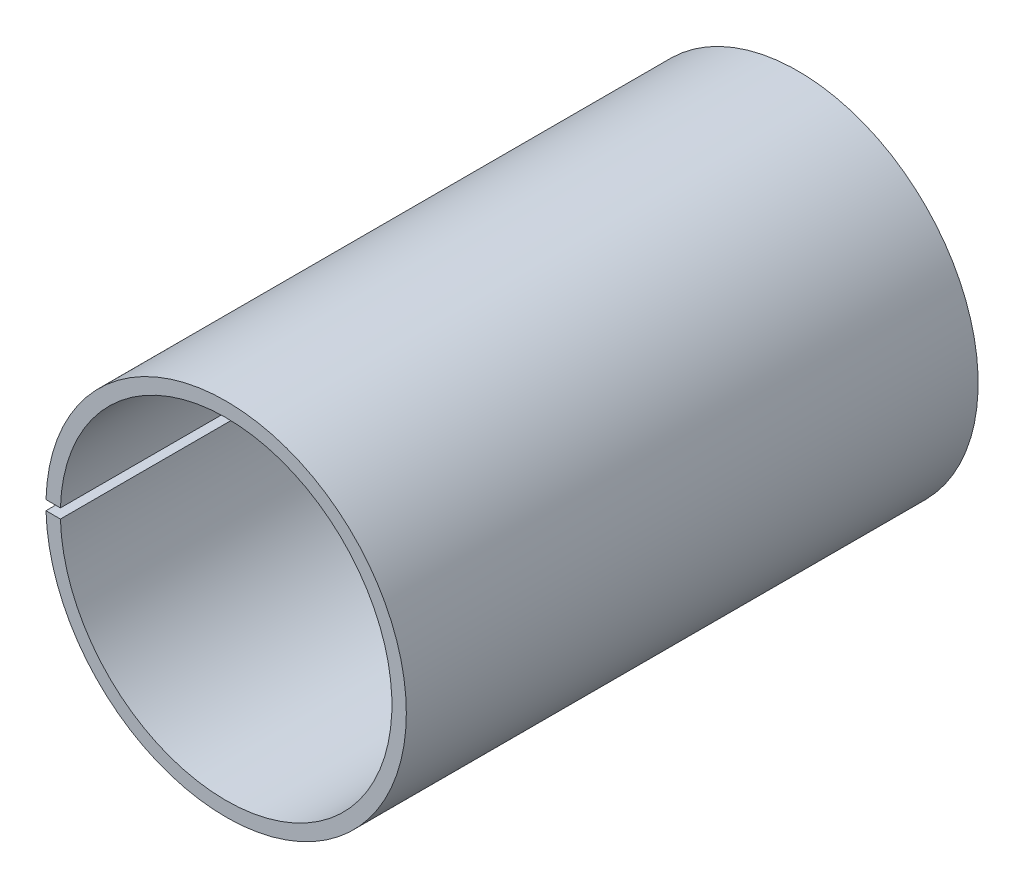
ISO-10303-21;
HEADER;
FILE_DESCRIPTION(('STEP AP214'),'2;1');
FILE_NAME('part.step','',(''),(''),'','','');
FILE_SCHEMA(('AUTOMOTIVE_DESIGN { 1 0 10303 214 1 1 1 1 }'));
ENDSEC;
DATA;
#1=APPLICATION_CONTEXT('core data for automotive mechanical design processes');
#2=APPLICATION_PROTOCOL_DEFINITION('international standard','automotive_design',2000,#1);
#3=PRODUCT_CONTEXT('',#1,'mechanical');
#4=PRODUCT('Part','Part','',(#3));
#5=PRODUCT_RELATED_PRODUCT_CATEGORY('part','',(#4));
#6=PRODUCT_DEFINITION_FORMATION('','',#4);
#7=PRODUCT_DEFINITION_CONTEXT('part definition',#1,'design');
#8=PRODUCT_DEFINITION('design','',#6,#7);
#9=PRODUCT_DEFINITION_SHAPE('','',#8);
#10=(LENGTH_UNIT() NAMED_UNIT(*) SI_UNIT(.MILLI.,.METRE.));
#11=(NAMED_UNIT(*) PLANE_ANGLE_UNIT() SI_UNIT($,.RADIAN.));
#12=(NAMED_UNIT(*) SI_UNIT($,.STERADIAN.) SOLID_ANGLE_UNIT());
#13=UNCERTAINTY_MEASURE_WITH_UNIT(LENGTH_MEASURE(1.E-05),#10,'distance_accuracy_value','');
#14=(GEOMETRIC_REPRESENTATION_CONTEXT(3) GLOBAL_UNCERTAINTY_ASSIGNED_CONTEXT((#13)) GLOBAL_UNIT_ASSIGNED_CONTEXT((#10,
#11,#12)) REPRESENTATION_CONTEXT('',''));
#15=CARTESIAN_POINT('',(0.,0.,0.));
#16=DIRECTION('',(0.,0.,1.));
#17=DIRECTION('',(1.,0.,0.));
#18=AXIS2_PLACEMENT_3D('',#15,#16,#17);
#19=CARTESIAN_POINT('',(-37.501,0.,-44.5));
#20=DIRECTION('',(1.,0.,0.));
#21=DIRECTION('',(0.,0.,-1.));
#22=AXIS2_PLACEMENT_3D('',#19,#20,#21);
#23=CYLINDRICAL_SURFACE('',#22,5.);
#24=CARTESIAN_POINT('',(-34.1357583773966,-5.,-44.5));
#25=CARTESIAN_POINT('',(-34.1357495207327,-5.00001593466062,-44.3601594966186));
#26=CARTESIAN_POINT('',(-34.1366173819966,-4.99413407462606,-44.2203222756865));
#27=CARTESIAN_POINT('',(-34.1400423843779,-4.97069061917161,-43.9416629096984));
#28=CARTESIAN_POINT('',(-34.1425993782241,-4.95313004198874,-43.8028406772149));
#29=CARTESIAN_POINT('',(-34.1493346927545,-4.90647141655123,-43.527351226803));
#30=CARTESIAN_POINT('',(-34.1535111731537,-4.8773864630738,-43.3906817454032));
#31=CARTESIAN_POINT('',(-34.1633621443041,-4.80790238828122,-43.1203064294253));
#32=CARTESIAN_POINT('',(-34.169036629403,-4.7675033096568,-42.9866005836668));
#33=CARTESIAN_POINT('',(-34.1817219351774,-4.67568490437873,-42.7230808368293));
#34=CARTESIAN_POINT('',(-34.1887328735937,-4.62426460671311,-42.5932672798256));
#35=CARTESIAN_POINT('',(-34.2038933438526,-4.51076024722466,-42.338401253765));
#36=CARTESIAN_POINT('',(-34.2120432960917,-4.44867224612949,-42.2133505644108));
#37=CARTESIAN_POINT('',(-34.2292452866395,-4.31431908892915,-41.9689754257693));
#38=CARTESIAN_POINT('',(-34.2382969475268,-4.24205818562902,-41.8496486114097));
#39=CARTESIAN_POINT('',(-34.2570540982671,-4.08782087195359,-41.6174394166818));
#40=CARTESIAN_POINT('',(-34.2667598301138,-4.00584085708042,-41.5045594503783));
#41=CARTESIAN_POINT('',(-34.2866122981189,-3.83221822073072,-41.2853817220055));
#42=CARTESIAN_POINT('',(-34.2967614016711,-3.74051867366778,-41.1791292645562));
#43=CARTESIAN_POINT('',(-34.3171615461575,-3.54848521642771,-40.9746730832459));
#44=CARTESIAN_POINT('',(-34.3274126234226,-3.44814812379263,-40.8764723522442));
#45=CARTESIAN_POINT('',(-34.3477227441915,-3.23958559115208,-40.6888643898108));
#46=CARTESIAN_POINT('',(-34.3577818284133,-3.13136184774518,-40.5994552767672));
#47=CARTESIAN_POINT('',(-34.3774316717444,-2.90771300593185,-40.4300005188279));
#48=CARTESIAN_POINT('',(-34.3870222567492,-2.7922852661171,-40.3499583396957));
#49=CARTESIAN_POINT('',(-34.4054996606062,-2.55457628652898,-40.199534464607));
#50=CARTESIAN_POINT('',(-34.4143834326083,-2.43226888630267,-40.1291937246617));
#51=CARTESIAN_POINT('',(-34.4311544502453,-2.18204727342353,-39.9990484798905));
#52=CARTESIAN_POINT('',(-34.43904132426,-2.05413099370397,-39.9392479009339));
#53=CARTESIAN_POINT('',(-34.4535867391194,-1.79369937593557,-39.8306815981175));
#54=CARTESIAN_POINT('',(-34.4602458511917,-1.66118621090048,-39.7819107401735));
#55=CARTESIAN_POINT('',(-34.4721527077645,-1.39240657728121,-39.69571712416));
#56=CARTESIAN_POINT('',(-34.4773999367066,-1.25613875762902,-39.6582985108035));
#57=CARTESIAN_POINT('',(-34.486295564223,-0.981874708549449,-39.5953536072419));
#58=CARTESIAN_POINT('',(-34.4899554386855,-0.843898563969835,-39.5697418706262));
#59=CARTESIAN_POINT('',(-34.4956334108415,-0.566254315458999,-39.530183943241));
#60=CARTESIAN_POINT('',(-34.497650937859,-0.426585640508265,-39.5162418073293));
#61=CARTESIAN_POINT('',(-34.501127471799,-0.00654619748531094,-39.4921737590813));
#62=CARTESIAN_POINT('',(-34.5000205556284,0.275163150869883,-39.4997363399398));
#63=CARTESIAN_POINT('',(-34.4933365305696,0.692213185270354,-39.5461771564353));
#64=CARTESIAN_POINT('',(-34.4902892498962,0.82987133585047,-39.5673814227808));
#65=CARTESIAN_POINT('',(-34.4826357235887,1.10290404187482,-39.6211773286965));
#66=CARTESIAN_POINT('',(-34.4780300196948,1.23827937372934,-39.6537650112827));
#67=CARTESIAN_POINT('',(-34.4673824321818,1.50582373482647,-39.7301080062177));
#68=CARTESIAN_POINT('',(-34.4613400289372,1.63799158488197,-39.7738673595595));
#69=CARTESIAN_POINT('',(-34.4479910412419,1.89812089450507,-39.8722078738541));
#70=CARTESIAN_POINT('',(-34.4406849075513,2.02608383462173,-39.9267851771607));
#71=CARTESIAN_POINT('',(-34.4249779863683,2.27745824812908,-40.0466138096051));
#72=CARTESIAN_POINT('',(-34.4165730129224,2.40084987498875,-40.1119062131812));
#73=CARTESIAN_POINT('',(-34.3989276312613,2.64165655449335,-40.2525203309755));
#74=CARTESIAN_POINT('',(-34.3896875233242,2.75907373174297,-40.3278384449541));
#75=CARTESIAN_POINT('',(-34.3706216973105,2.98721863238484,-40.488022988966));
#76=CARTESIAN_POINT('',(-34.3607957613783,3.09794383597494,-40.5728929816668));
#77=CARTESIAN_POINT('',(-34.3408372049493,3.31186331871825,-40.7515371865901));
#78=CARTESIAN_POINT('',(-34.3307046956701,3.41506028367509,-40.8453081955041));
#79=CARTESIAN_POINT('',(-34.3103143814529,3.61420006053363,-41.0420621406065));
#80=CARTESIAN_POINT('',(-34.3000562965955,3.71006520710218,-41.1451236729286));
#81=CARTESIAN_POINT('',(-34.2798040986215,3.89274665252293,-41.358935145868));
#82=CARTESIAN_POINT('',(-34.2698098907053,3.97956623500926,-41.46968227204));
#83=CARTESIAN_POINT('',(-34.2503587979484,4.14364020611898,-41.6982068645299));
#84=CARTESIAN_POINT('',(-34.2409022763248,4.22088816951672,-41.8159889755182));
#85=CARTESIAN_POINT('',(-34.2228076201595,4.36517188213724,-42.0576504448589));
#86=CARTESIAN_POINT('',(-34.2141691788892,4.43221146463752,-42.1815274913106));
#87=CARTESIAN_POINT('',(-34.1979416895623,4.55572970905516,-42.434762491711));
#88=CARTESIAN_POINT('',(-34.190354411104,4.61219061708731,-42.5641292204842));
#89=CARTESIAN_POINT('',(-34.1764695881894,4.71397559689892,-42.827183517821));
#90=CARTESIAN_POINT('',(-34.1701715493273,4.75930393920247,-42.960869407188));
#91=CARTESIAN_POINT('',(-34.1590518246573,4.83846835994948,-43.231504030664));
#92=CARTESIAN_POINT('',(-34.154228571663,4.87231664192657,-43.3684491333303));
#93=CARTESIAN_POINT('',(-34.146192913372,4.92831726452346,-43.6447003336019));
#94=CARTESIAN_POINT('',(-34.1429797310658,4.95047524707727,-43.7840052587514));
#95=CARTESIAN_POINT('',(-34.1390039684665,4.97780404190264,-44.019642557034));
#96=CARTESIAN_POINT('',(-34.1377875671994,4.98613222684085,-44.1156128688178));
#97=CARTESIAN_POINT('',(-34.1361646134129,4.99722661968588,-44.3077189835021));
#98=CARTESIAN_POINT('',(-34.1357567002741,5.00000217229248,-44.4038542353856));
#99=CARTESIAN_POINT('',(-34.1357583773966,5.,-44.5));
#100=B_SPLINE_CURVE_WITH_KNOTS('',3,(#24,#25,#26,#27,#28,#29,#30,#31,#32,#33,#34,#35,#36,#37,
#38,#39,#40,#41,#42,#43,#44,#45,#46,#47,#48,#49,#50,#51,#52,#53,#54,#55,#56,#57,#58,#59,#60,#61,
#62,#63,#64,#65,#66,#67,#68,#69,#70,#71,#72,#73,#74,#75,#76,#77,#78,#79,#80,#81,#82,#83,#84,#85,
#86,#87,#88,#89,#90,#91,#92,#93,#94,#95,#96,#97,#98,#99),.UNSPECIFIED.,.F.,.F.,(4,2,2,2,2,2,2,2,
2,2,2,2,2,2,2,2,2,2,2,2,2,2,2,2,2,2,2,2,2,2,2,2,2,2,2,2,2,4),(0.,0.419390335518171,
0.838744110275161,1.25762274705706,1.67649980333741,2.09541377948577,2.5144827821535,
2.93337710945545,3.35242727971082,3.77408374075882,4.19589622932859,4.61761824276198,
5.03949580317238,5.46310316466812,5.88686797431181,6.31043512321333,6.73415673121515,
7.15476177070528,7.57551289800937,8.41608693775482,8.83366233498114,9.25109272322552,
9.66867431796741,10.0861072714853,10.5051794513517,10.9241015460512,11.3431804117277,
11.7621090265022,12.1849918664823,12.6077206567612,13.0307316960457,13.4535834996303,
13.8771387281586,14.3005312234929,14.7234722230552,15.1462089170654,15.4350710718346,
15.7234466810521),.UNSPECIFIED.);
#101=CARTESIAN_POINT('',(-34.4855042010408,1.,-39.6010205144336));
#102=VERTEX_POINT('',#101);
#103=CARTESIAN_POINT('',(-34.1357583773966,5.,-44.5));
#104=VERTEX_POINT('',#103);
#105=EDGE_CURVE('E113',#102,#104,#100,.T.);
#106=ORIENTED_EDGE('',*,*,#105,.F.);
#107=DIRECTION('',(1.,0.,0.));
#108=VECTOR('',#107,1.);
#109=CARTESIAN_POINT('',(-37.501,1.,-39.6010205144336));
#110=LINE('',#109,#108);
#111=CARTESIAN_POINT('',(-37.4866642954531,1.,-39.6010205144336));
#112=VERTEX_POINT('',#111);
#113=EDGE_CURVE('E165',#112,#102,#110,.T.);
#114=ORIENTED_EDGE('',*,*,#113,.F.);
#115=CARTESIAN_POINT('',(-37.1651718682963,-5.,-44.5));
#116=CARTESIAN_POINT('',(-37.1651637470477,-5.00001580979405,-44.3600384370275));
#117=CARTESIAN_POINT('',(-37.1659622210388,-4.99412390516598,-44.2200799841313));
#118=CARTESIAN_POINT('',(-37.1691135527353,-4.97063950088845,-43.9411767485982));
#119=CARTESIAN_POINT('',(-37.1714662844249,-4.95304794981952,-43.802231884705));
#120=CARTESIAN_POINT('',(-37.1776640338752,-4.90630400576495,-43.526487464546));
#121=CARTESIAN_POINT('',(-37.1815074565271,-4.87716396947272,-43.3896857772254));
#122=CARTESIAN_POINT('',(-37.1905734124358,-4.80754496925862,-43.1190469203581));
#123=CARTESIAN_POINT('',(-37.1957959386859,-4.76706606294577,-42.9852097357534));
#124=CARTESIAN_POINT('',(-37.2074717716171,-4.67506049985762,-42.7214263346895));
#125=CARTESIAN_POINT('',(-37.2139252244315,-4.62353253126795,-42.5914805823352));
#126=CARTESIAN_POINT('',(-37.2278809384076,-4.50978533332337,-42.336357241749));
#127=CARTESIAN_POINT('',(-37.2353835867118,-4.44756215559284,-42.2111814353737));
#128=CARTESIAN_POINT('',(-37.2512197230548,-4.3129131384033,-41.966570890887));
#129=CARTESIAN_POINT('',(-37.2595528444626,-4.24049179537262,-41.8471336535687));
#130=CARTESIAN_POINT('',(-37.2768212023298,-4.08590862480682,-41.6147208043162));
#131=CARTESIAN_POINT('',(-37.2857566613806,-4.00374318777107,-41.5017476099722));
#132=CARTESIAN_POINT('',(-37.3040239567505,-3.82981459375156,-41.282516471358));
#133=CARTESIAN_POINT('',(-37.3133576150067,-3.7380036815021,-41.1762965633505));
#134=CARTESIAN_POINT('',(-37.3321176598915,-3.54574679369693,-40.9719168800055));
#135=CARTESIAN_POINT('',(-37.3415440795454,-3.44529763637793,-40.8737601008494));
#136=CARTESIAN_POINT('',(-37.3602188986821,-3.23651409003919,-40.6862538740475));
#137=CARTESIAN_POINT('',(-37.369467335996,-3.12818140064043,-40.5969025377464));
#138=CARTESIAN_POINT('',(-37.3875317014284,-2.90432180442261,-40.4275783516507));
#139=CARTESIAN_POINT('',(-37.396347468737,-2.78879225842019,-40.3476089737118));
#140=CARTESIAN_POINT('',(-37.4133236343656,-2.55097455187516,-40.1973989721137));
#141=CARTESIAN_POINT('',(-37.421481706843,-2.42866478366178,-40.1271922885945));
#142=CARTESIAN_POINT('',(-37.4368805182979,-2.1784606727303,-39.9973136388445));
#143=CARTESIAN_POINT('',(-37.4441209155602,-2.0505642734129,-39.9376455936577));
#144=CARTESIAN_POINT('',(-37.457471674016,-1.79019445075284,-39.8293390576829));
#145=CARTESIAN_POINT('',(-37.4635825548032,-1.65772316537527,-39.7806954931364));
#146=CARTESIAN_POINT('',(-37.4745064244377,-1.3890489209886,-39.6947478316197));
#147=CARTESIAN_POINT('',(-37.4793189384886,-1.25284461686411,-39.6574478822357));
#148=CARTESIAN_POINT('',(-37.487478692174,-0.978579612179495,-39.5946935377548));
#149=CARTESIAN_POINT('',(-37.4908349596386,-0.840535981364348,-39.5691660964425));
#150=CARTESIAN_POINT('',(-37.496035462256,-0.562768828489788,-39.5297867041538));
#151=CARTESIAN_POINT('',(-37.4978791717321,-0.423044739504882,-39.5159388122594));
#152=CARTESIAN_POINT('',(-37.5010384944133,-0.00285282080231904,-39.492165047985));
#153=CARTESIAN_POINT('',(-37.4999915116017,0.278937313274021,-39.4999400109844));
#154=CARTESIAN_POINT('',(-37.493795621099,0.696252599761525,-39.546737463294));
#155=CARTESIAN_POINT('',(-37.4909730777515,0.834101476167466,-39.5680889523454));
#156=CARTESIAN_POINT('',(-37.483890481236,1.10750465536123,-39.6222135159313));
#157=CARTESIAN_POINT('',(-37.4796309276124,1.24305973836157,-39.6549826215167));
#158=CARTESIAN_POINT('',(-37.469788222477,1.51094990104977,-39.7317228901254));
#159=CARTESIAN_POINT('',(-37.4642045931692,1.64328379931327,-39.7756980973271));
#160=CARTESIAN_POINT('',(-37.4518731988771,1.90372737385237,-39.8745044854375));
#161=CARTESIAN_POINT('',(-37.4451258510427,2.03183854428584,-39.9293317773119));
#162=CARTESIAN_POINT('',(-37.430627981438,2.28342369944281,-40.0496642871438));
#163=CARTESIAN_POINT('',(-37.4228741082609,2.40688032959573,-40.115205376638));
#164=CARTESIAN_POINT('',(-37.4066004280571,2.647794795432,-40.2563382502258));
#165=CARTESIAN_POINT('',(-37.3980808976018,2.76525477338147,-40.3319264097962));
#166=CARTESIAN_POINT('',(-37.3805071827414,2.99345730173431,-40.4926693042601));
#167=CARTESIAN_POINT('',(-37.3714528037639,3.10419737743412,-40.5778275309406));
#168=CARTESIAN_POINT('',(-37.3530673386214,3.31811447194109,-40.7570625212665));
#169=CARTESIAN_POINT('',(-37.3437363532957,3.42129420044958,-40.8511360615788));
#170=CARTESIAN_POINT('',(-37.3249789055035,3.62022284353852,-41.0483682537192));
#171=CARTESIAN_POINT('',(-37.3155522779226,3.71590545282845,-41.1515937786543));
#172=CARTESIAN_POINT('',(-37.296948587285,3.89820740683747,-41.365715008369));
#173=CARTESIAN_POINT('',(-37.2877714343797,3.98483004739223,-41.4766078993574));
#174=CARTESIAN_POINT('',(-37.2699176756359,4.14849612221482,-41.7054022908017));
#175=CARTESIAN_POINT('',(-37.2612414093625,4.22553309803553,-41.8233084383033));
#176=CARTESIAN_POINT('',(-37.2446471173221,4.36938254144842,-42.0651922559112));
#177=CARTESIAN_POINT('',(-37.2367288081427,4.43619883635233,-42.1891676302201));
#178=CARTESIAN_POINT('',(-37.2218630051217,4.55925030205557,-42.442549544379));
#179=CARTESIAN_POINT('',(-37.2149169816648,4.61546949044965,-42.5719639334402));
#180=CARTESIAN_POINT('',(-37.2022135621998,4.71676934161267,-42.835082075074));
#181=CARTESIAN_POINT('',(-37.1964557120103,4.7618542617778,-42.9687841659999));
#182=CARTESIAN_POINT('',(-37.1862985196108,4.84053465539676,-43.2394194406102));
#183=CARTESIAN_POINT('',(-37.1818977291446,4.87414238147519,-43.3763490106975));
#184=CARTESIAN_POINT('',(-37.1745766115416,4.92966930706451,-43.6525405447053));
#185=CARTESIAN_POINT('',(-37.1716555684515,4.95159415942299,-43.7918013469361));
#186=CARTESIAN_POINT('',(-37.1680731513888,4.97839891887776,-44.0261092693297));
#187=CARTESIAN_POINT('',(-37.1669857406247,4.9865040100507,-44.1207932600004));
#188=CARTESIAN_POINT('',(-37.1655349885731,4.99730098833021,-44.310315039802));
#189=CARTESIAN_POINT('',(-37.1651704324232,5.00000195791881,-44.4051523023359));
#190=CARTESIAN_POINT('',(-37.1651718682963,5.,-44.5));
#191=B_SPLINE_CURVE_WITH_KNOTS('',3,(#115,#116,#117,#118,#119,#120,#121,#122,#123,#124,#125,
#126,#127,#128,#129,#130,#131,#132,#133,#134,#135,#136,#137,#138,#139,#140,#141,#142,#143,#144,
#145,#146,#147,#148,#149,#150,#151,#152,#153,#154,#155,#156,#157,#158,#159,#160,#161,#162,#163,
#164,#165,#166,#167,#168,#169,#170,#171,#172,#173,#174,#175,#176,#177,#178,#179,#180,#181,#182,
#183,#184,#185,#186,#187,#188,#189,#190),.UNSPECIFIED.,.F.,.F.,(4,2,2,2,2,2,2,2,2,2,2,2,2,2,2,2,
2,2,2,2,2,2,2,2,2,2,2,2,2,2,2,2,2,2,2,2,2,4),(0.,0.419753889608401,0.839473750681574,
1.25874572552589,1.67801557022742,2.09733522087851,2.516810006548,2.93610041916768,
3.35554663737769,3.77717728039385,4.1989638951902,4.62065984432959,5.04251135587492,
5.46579461345412,5.88923502908525,6.31248016866782,6.73587987458322,7.15661589696441,
7.57749808073246,8.41834205725349,8.8365351167954,9.25458295042969,9.67278186785235,
10.090831186845,10.5103100036967,10.9296379004406,11.349119295269,11.7684496009644,
12.1911463322652,12.6136887561624,13.0365143485958,13.4591812169691,13.8824805324932,
14.3056177401123,14.7283017996697,15.1507811541809,15.4357437863123,15.7202270899683),.UNSPECIFIED.);
#192=CARTESIAN_POINT('',(-37.1651718682963,5.,-44.5));
#193=VERTEX_POINT('',#192);
#194=EDGE_CURVE('E120',#112,#193,#191,.T.);
#195=ORIENTED_EDGE('',*,*,#194,.T.);
#196=DIRECTION('',(1.,0.,0.));
#197=VECTOR('',#196,1.);
#198=CARTESIAN_POINT('',(-37.501,5.,-44.5));
#199=LINE('',#198,#197);
#200=EDGE_CURVE('E167',#193,#104,#199,.T.);
#201=ORIENTED_EDGE('',*,*,#200,.T.);
#202=EDGE_LOOP('',(#106,#114,#195,#201));
#203=FACE_BOUND('',#202,.T.);
#204=ADVANCED_FACE('F35',(#203),#23,.F.);
#205=CARTESIAN_POINT('',(0.,0.,59.5));
#206=DIRECTION('',(0.,0.,1.));
#207=DIRECTION('',(1.,0.,0.));
#208=AXIS2_PLACEMENT_3D('',#205,#206,#207);
#209=PLANE('',#208);
#210=DIRECTION('',(1.,0.,0.));
#211=VECTOR('',#210,1.);
#212=CARTESIAN_POINT('',(-37.501,1.,59.5));
#213=LINE('',#212,#211);
#214=CARTESIAN_POINT('',(-37.4866642954531,1.,59.5));
#215=VERTEX_POINT('',#214);
#216=CARTESIAN_POINT('',(-34.4855042010408,1.,59.5));
#217=VERTEX_POINT('',#216);
#218=EDGE_CURVE('E105',#215,#217,#213,.T.);
#219=ORIENTED_EDGE('',*,*,#218,.T.);
#220=CARTESIAN_POINT('',(0.,0.,59.5));
#221=DIRECTION('',(0.,0.,1.));
#222=DIRECTION('',(1.,0.,0.));
#223=AXIS2_PLACEMENT_3D('',#220,#221,#222);
#224=CIRCLE('',#223,34.5);
#225=CARTESIAN_POINT('',(-34.4855042010408,-1.,59.5));
#226=VERTEX_POINT('',#225);
#227=EDGE_CURVE('E187',#226,#217,#224,.T.);
#228=ORIENTED_EDGE('',*,*,#227,.F.);
#229=DIRECTION('',(1.,0.,0.));
#230=VECTOR('',#229,1.);
#231=CARTESIAN_POINT('',(-37.501,-1.,59.5));
#232=LINE('',#231,#230);
#233=CARTESIAN_POINT('',(-37.4866642954531,-1.,59.5));
#234=VERTEX_POINT('',#233);
#235=EDGE_CURVE('E177',#234,#226,#232,.T.);
#236=ORIENTED_EDGE('',*,*,#235,.F.);
#237=CARTESIAN_POINT('',(0.,0.,59.5));
#238=DIRECTION('',(0.,0.,1.));
#239=DIRECTION('',(1.,0.,0.));
#240=AXIS2_PLACEMENT_3D('',#237,#238,#239);
#241=CIRCLE('',#240,37.5);
#242=EDGE_CURVE('E11',#234,#215,#241,.T.);
#243=ORIENTED_EDGE('',*,*,#242,.T.);
#244=EDGE_LOOP('',(#219,#228,#236,#243));
#245=FACE_BOUND('',#244,.T.);
#246=ADVANCED_FACE('F154',(#245),#209,.T.);
#247=CARTESIAN_POINT('',(0.,0.,-59.5));
#248=DIRECTION('',(0.,0.,1.));
#249=DIRECTION('',(1.,0.,0.));
#250=AXIS2_PLACEMENT_3D('',#247,#248,#249);
#251=PLANE('',#250);
#252=CARTESIAN_POINT('',(0.,0.,-59.5));
#253=DIRECTION('',(0.,0.,1.));
#254=DIRECTION('',(1.,0.,0.));
#255=AXIS2_PLACEMENT_3D('',#252,#253,#254);
#256=CIRCLE('',#255,37.5);
#257=CARTESIAN_POINT('',(-37.1651718682963,-5.,-59.5));
#258=VERTEX_POINT('',#257);
#259=CARTESIAN_POINT('',(-37.1651718682963,5.,-59.5));
#260=VERTEX_POINT('',#259);
#261=EDGE_CURVE('E39',#258,#260,#256,.T.);
#262=ORIENTED_EDGE('',*,*,#261,.F.);
#263=DIRECTION('',(1.,0.,0.));
#264=VECTOR('',#263,1.);
#265=CARTESIAN_POINT('',(-37.501,-5.,-59.5));
#266=LINE('',#265,#264);
#267=CARTESIAN_POINT('',(-34.1357583773966,-5.,-59.5));
#268=VERTEX_POINT('',#267);
#269=EDGE_CURVE('E198',#258,#268,#266,.T.);
#270=ORIENTED_EDGE('',*,*,#269,.T.);
#271=CARTESIAN_POINT('',(0.,0.,-59.5));
#272=DIRECTION('',(0.,0.,1.));
#273=DIRECTION('',(1.,0.,0.));
#274=AXIS2_PLACEMENT_3D('',#271,#272,#273);
#275=CIRCLE('',#274,34.5);
#276=CARTESIAN_POINT('',(-34.1357583773966,5.,-59.5));
#277=VERTEX_POINT('',#276);
#278=EDGE_CURVE('E188',#268,#277,#275,.T.);
#279=ORIENTED_EDGE('',*,*,#278,.T.);
#280=DIRECTION('',(1.,0.,0.));
#281=VECTOR('',#280,1.);
#282=CARTESIAN_POINT('',(-37.501,5.,-59.5));
#283=LINE('',#282,#281);
#284=EDGE_CURVE('E122',#260,#277,#283,.T.);
#285=ORIENTED_EDGE('',*,*,#284,.F.);
#286=EDGE_LOOP('',(#262,#270,#279,#285));
#287=FACE_BOUND('',#286,.T.);
#288=ADVANCED_FACE('F160',(#287),#251,.F.);
#289=CARTESIAN_POINT('',(0.,0.,59.5));
#290=DIRECTION('',(0.,0.,-1.));
#291=DIRECTION('',(-1.,0.,0.));
#292=AXIS2_PLACEMENT_3D('',#289,#290,#291);
#293=CYLINDRICAL_SURFACE('',#292,37.5);
#294=ORIENTED_EDGE('',*,*,#194,.F.);
#295=DIRECTION('',(0.,0.,-1.));
#296=VECTOR('',#295,1.);
#297=CARTESIAN_POINT('',(-37.4866642954531,1.,59.5));
#298=LINE('',#297,#296);
#299=EDGE_CURVE('E58',#215,#112,#298,.T.);
#300=ORIENTED_EDGE('',*,*,#299,.F.);
#301=ORIENTED_EDGE('',*,*,#242,.F.);
#302=DIRECTION('',(0.,0.,-1.));
#303=VECTOR('',#302,1.);
#304=CARTESIAN_POINT('',(-37.4866642954531,-1.,59.5));
#305=LINE('',#304,#303);
#306=CARTESIAN_POINT('',(-37.4866642954531,-1.,-39.6010205144336));
#307=VERTEX_POINT('',#306);
#308=EDGE_CURVE('E100',#307,#234,#305,.F.);
#309=ORIENTED_EDGE('',*,*,#308,.F.);
#310=CARTESIAN_POINT('',(-37.1651718682963,-5.,-44.5));
#311=VERTEX_POINT('',#310);
#312=EDGE_CURVE('E112',#311,#307,#191,.T.);
#313=ORIENTED_EDGE('',*,*,#312,.F.);
#314=DIRECTION('',(0.,0.,-1.));
#315=VECTOR('',#314,1.);
#316=CARTESIAN_POINT('',(-37.1651718682963,-5.,59.5));
#317=LINE('',#316,#315);
#318=EDGE_CURVE('E119',#258,#311,#317,.F.);
#319=ORIENTED_EDGE('',*,*,#318,.F.);
#320=ORIENTED_EDGE('',*,*,#261,.T.);
#321=DIRECTION('',(0.,0.,-1.));
#322=VECTOR('',#321,1.);
#323=CARTESIAN_POINT('',(-37.1651718682963,5.,59.5));
#324=LINE('',#323,#322);
#325=EDGE_CURVE('E192',#193,#260,#324,.T.);
#326=ORIENTED_EDGE('',*,*,#325,.F.);
#327=EDGE_LOOP('',(#294,#300,#301,#309,#313,#319,#320,#326));
#328=FACE_BOUND('',#327,.T.);
#329=ADVANCED_FACE('F37',(#328),#293,.T.);
#330=CARTESIAN_POINT('',(0.,0.,59.5));
#331=DIRECTION('',(0.,0.,-1.));
#332=DIRECTION('',(-1.,0.,0.));
#333=AXIS2_PLACEMENT_3D('',#330,#331,#332);
#334=CYLINDRICAL_SURFACE('',#333,34.5);
#335=DIRECTION('',(0.,0.,-1.));
#336=VECTOR('',#335,1.);
#337=CARTESIAN_POINT('',(-34.4855042010408,1.,59.5));
#338=LINE('',#337,#336);
#339=EDGE_CURVE('E182',#217,#102,#338,.T.);
#340=ORIENTED_EDGE('',*,*,#339,.T.);
#341=ORIENTED_EDGE('',*,*,#105,.T.);
#342=DIRECTION('',(0.,0.,-1.));
#343=VECTOR('',#342,1.);
#344=CARTESIAN_POINT('',(-34.1357583773966,5.,59.5));
#345=LINE('',#344,#343);
#346=EDGE_CURVE('E196',#104,#277,#345,.T.);
#347=ORIENTED_EDGE('',*,*,#346,.T.);
#348=ORIENTED_EDGE('',*,*,#278,.F.);
#349=DIRECTION('',(0.,0.,-1.));
#350=VECTOR('',#349,1.);
#351=CARTESIAN_POINT('',(-34.1357583773966,-5.,59.5));
#352=LINE('',#351,#350);
#353=CARTESIAN_POINT('',(-34.1357583773966,-5.,-44.5));
#354=VERTEX_POINT('',#353);
#355=EDGE_CURVE('E124',#268,#354,#352,.F.);
#356=ORIENTED_EDGE('',*,*,#355,.T.);
#357=CARTESIAN_POINT('',(-34.4855042010408,-1.,-39.6010205144336));
#358=VERTEX_POINT('',#357);
#359=EDGE_CURVE('E171',#354,#358,#100,.T.);
#360=ORIENTED_EDGE('',*,*,#359,.T.);
#361=DIRECTION('',(0.,0.,-1.));
#362=VECTOR('',#361,1.);
#363=CARTESIAN_POINT('',(-34.4855042010408,-1.,59.5));
#364=LINE('',#363,#362);
#365=EDGE_CURVE('E50',#358,#226,#364,.F.);
#366=ORIENTED_EDGE('',*,*,#365,.T.);
#367=ORIENTED_EDGE('',*,*,#227,.T.);
#368=EDGE_LOOP('',(#340,#341,#347,#348,#356,#360,#366,#367));
#369=FACE_BOUND('',#368,.T.);
#370=ADVANCED_FACE('F142',(#369),#334,.F.);
#371=CARTESIAN_POINT('',(-37.501,-5.,-44.5));
#372=DIRECTION('',(0.,-1.,0.));
#373=DIRECTION('',(0.,0.,-1.));
#374=AXIS2_PLACEMENT_3D('',#371,#372,#373);
#375=PLANE('',#374);
#376=ORIENTED_EDGE('',*,*,#318,.T.);
#377=DIRECTION('',(1.,0.,0.));
#378=VECTOR('',#377,1.);
#379=CARTESIAN_POINT('',(-37.501,-5.,-44.5));
#380=LINE('',#379,#378);
#381=EDGE_CURVE('E117',#311,#354,#380,.T.);
#382=ORIENTED_EDGE('',*,*,#381,.T.);
#383=ORIENTED_EDGE('',*,*,#355,.F.);
#384=ORIENTED_EDGE('',*,*,#269,.F.);
#385=EDGE_LOOP('',(#376,#382,#383,#384));
#386=FACE_BOUND('',#385,.T.);
#387=ADVANCED_FACE('F140',(#386),#375,.F.);
#388=ORIENTED_EDGE('',*,*,#312,.T.);
#389=DIRECTION('',(1.,0.,0.));
#390=VECTOR('',#389,1.);
#391=CARTESIAN_POINT('',(-37.501,-1.,-39.6010205144336));
#392=LINE('',#391,#390);
#393=EDGE_CURVE('E97',#358,#307,#392,.F.);
#394=ORIENTED_EDGE('',*,*,#393,.F.);
#395=ORIENTED_EDGE('',*,*,#359,.F.);
#396=ORIENTED_EDGE('',*,*,#381,.F.);
#397=EDGE_LOOP('',(#388,#394,#395,#396));
#398=FACE_BOUND('',#397,.T.);
#399=ADVANCED_FACE('F115',(#398),#23,.F.);
#400=CARTESIAN_POINT('',(-37.501,5.,-44.5));
#401=DIRECTION('',(0.,1.,0.));
#402=DIRECTION('',(0.,0.,1.));
#403=AXIS2_PLACEMENT_3D('',#400,#401,#402);
#404=PLANE('',#403);
#405=ORIENTED_EDGE('',*,*,#325,.T.);
#406=ORIENTED_EDGE('',*,*,#284,.T.);
#407=ORIENTED_EDGE('',*,*,#346,.F.);
#408=ORIENTED_EDGE('',*,*,#200,.F.);
#409=EDGE_LOOP('',(#405,#406,#407,#408));
#410=FACE_BOUND('',#409,.T.);
#411=ADVANCED_FACE('F149',(#410),#404,.F.);
#412=CARTESIAN_POINT('',(-37.501,-1.,-59.5));
#413=DIRECTION('',(0.,-1.,0.));
#414=DIRECTION('',(0.,0.,-1.));
#415=AXIS2_PLACEMENT_3D('',#412,#413,#414);
#416=PLANE('',#415);
#417=ORIENTED_EDGE('',*,*,#308,.T.);
#418=ORIENTED_EDGE('',*,*,#235,.T.);
#419=ORIENTED_EDGE('',*,*,#365,.F.);
#420=ORIENTED_EDGE('',*,*,#393,.T.);
#421=EDGE_LOOP('',(#417,#418,#419,#420));
#422=FACE_BOUND('',#421,.T.);
#423=ADVANCED_FACE('F99',(#422),#416,.F.);
#424=CARTESIAN_POINT('',(-37.501,1.,-59.5));
#425=DIRECTION('',(0.,1.,0.));
#426=DIRECTION('',(0.,0.,1.));
#427=AXIS2_PLACEMENT_3D('',#424,#425,#426);
#428=PLANE('',#427);
#429=ORIENTED_EDGE('',*,*,#299,.T.);
#430=ORIENTED_EDGE('',*,*,#113,.T.);
#431=ORIENTED_EDGE('',*,*,#339,.F.);
#432=ORIENTED_EDGE('',*,*,#218,.F.);
#433=EDGE_LOOP('',(#429,#430,#431,#432));
#434=FACE_BOUND('',#433,.T.);
#435=ADVANCED_FACE('F184',(#434),#428,.F.);
#436=CLOSED_SHELL('',(#204,#246,#288,#329,#370,#387,#399,#411,#423,#435));
#437=MANIFOLD_SOLID_BREP('B2',#436);
#438=ADVANCED_BREP_SHAPE_REPRESENTATION('',(#18,#437),#14);
#439=SHAPE_DEFINITION_REPRESENTATION(#9,#438);
ENDSEC;
END-ISO-10303-21;
